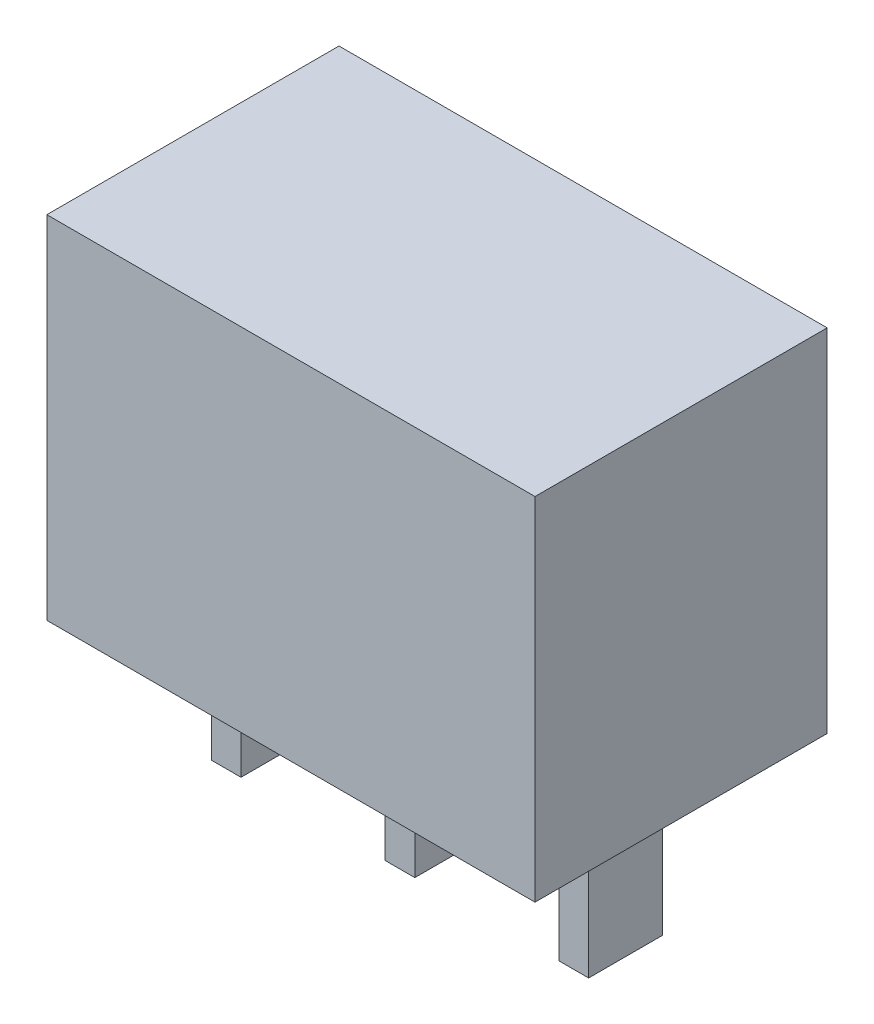
ISO-10303-21;
HEADER;
FILE_DESCRIPTION(('STEP AP214'),'2;1');
FILE_NAME('part.step','',(''),(''),'','','');
FILE_SCHEMA(('AUTOMOTIVE_DESIGN { 1 0 10303 214 1 1 1 1 }'));
ENDSEC;
DATA;
#1=APPLICATION_CONTEXT('core data for automotive mechanical design processes');
#2=APPLICATION_PROTOCOL_DEFINITION('international standard','automotive_design',2000,#1);
#3=PRODUCT_CONTEXT('',#1,'mechanical');
#4=PRODUCT('Part','Part','',(#3));
#5=PRODUCT_RELATED_PRODUCT_CATEGORY('part','',(#4));
#6=PRODUCT_DEFINITION_FORMATION('','',#4);
#7=PRODUCT_DEFINITION_CONTEXT('part definition',#1,'design');
#8=PRODUCT_DEFINITION('design','',#6,#7);
#9=PRODUCT_DEFINITION_SHAPE('','',#8);
#10=(LENGTH_UNIT() NAMED_UNIT(*) SI_UNIT(.MILLI.,.METRE.));
#11=(NAMED_UNIT(*) PLANE_ANGLE_UNIT() SI_UNIT($,.RADIAN.));
#12=(NAMED_UNIT(*) SI_UNIT($,.STERADIAN.) SOLID_ANGLE_UNIT());
#13=UNCERTAINTY_MEASURE_WITH_UNIT(LENGTH_MEASURE(1.E-05),#10,'distance_accuracy_value','');
#14=(GEOMETRIC_REPRESENTATION_CONTEXT(3) GLOBAL_UNCERTAINTY_ASSIGNED_CONTEXT((#13)) GLOBAL_UNIT_ASSIGNED_CONTEXT((#10,
#11,#12)) REPRESENTATION_CONTEXT('',''));
#15=CARTESIAN_POINT('',(0.,0.,0.));
#16=DIRECTION('',(0.,0.,1.));
#17=DIRECTION('',(1.,0.,0.));
#18=AXIS2_PLACEMENT_3D('',#15,#16,#17);
#19=CARTESIAN_POINT('',(0.,0.,0.));
#20=DIRECTION('',(0.,1.,0.));
#21=DIRECTION('',(0.,0.,1.));
#22=AXIS2_PLACEMENT_3D('',#19,#20,#21);
#23=PLANE('',#22);
#24=DIRECTION('',(0.,0.,1.));
#25=VECTOR('',#24,1.);
#26=CARTESIAN_POINT('',(5.1,0.,1.));
#27=LINE('',#26,#25);
#28=CARTESIAN_POINT('',(5.1,0.,-1.));
#29=VERTEX_POINT('',#28);
#30=CARTESIAN_POINT('',(5.1,0.,1.));
#31=VERTEX_POINT('',#30);
#32=EDGE_CURVE('E227',#29,#31,#27,.T.);
#33=ORIENTED_EDGE('',*,*,#32,.F.);
#34=DIRECTION('',(1.,0.,0.));
#35=VECTOR('',#34,1.);
#36=CARTESIAN_POINT('',(4.3,0.,-1.));
#37=LINE('',#36,#35);
#38=CARTESIAN_POINT('',(4.3,0.,-1.));
#39=VERTEX_POINT('',#38);
#40=EDGE_CURVE('E214',#39,#29,#37,.T.);
#41=ORIENTED_EDGE('',*,*,#40,.F.);
#42=DIRECTION('',(0.,0.,-1.));
#43=VECTOR('',#42,1.);
#44=CARTESIAN_POINT('',(4.3,0.,1.));
#45=LINE('',#44,#43);
#46=CARTESIAN_POINT('',(4.3,0.,1.));
#47=VERTEX_POINT('',#46);
#48=EDGE_CURVE('E218',#47,#39,#45,.T.);
#49=ORIENTED_EDGE('',*,*,#48,.F.);
#50=DIRECTION('',(-1.,0.,0.));
#51=VECTOR('',#50,1.);
#52=CARTESIAN_POINT('',(4.3,0.,1.));
#53=LINE('',#52,#51);
#54=EDGE_CURVE('E223',#31,#47,#53,.T.);
#55=ORIENTED_EDGE('',*,*,#54,.F.);
#56=EDGE_LOOP('',(#33,#41,#49,#55));
#57=FACE_BOUND('',#56,.T.);
#58=DIRECTION('',(0.,0.,-1.));
#59=VECTOR('',#58,1.);
#60=CARTESIAN_POINT('',(6.6,0.,-3.95));
#61=LINE('',#60,#59);
#62=CARTESIAN_POINT('',(6.6,0.,3.95));
#63=VERTEX_POINT('',#62);
#64=CARTESIAN_POINT('',(6.6,0.,-3.95));
#65=VERTEX_POINT('',#64);
#66=EDGE_CURVE('E287',#63,#65,#61,.T.);
#67=ORIENTED_EDGE('',*,*,#66,.F.);
#68=DIRECTION('',(1.,0.,0.));
#69=VECTOR('',#68,1.);
#70=CARTESIAN_POINT('',(-6.6,0.,3.95));
#71=LINE('',#70,#69);
#72=CARTESIAN_POINT('',(-6.6,0.,3.95));
#73=VERTEX_POINT('',#72);
#74=EDGE_CURVE('E293',#73,#63,#71,.T.);
#75=ORIENTED_EDGE('',*,*,#74,.F.);
#76=DIRECTION('',(0.,0.,1.));
#77=VECTOR('',#76,1.);
#78=CARTESIAN_POINT('',(-6.6,0.,-3.95));
#79=LINE('',#78,#77);
#80=CARTESIAN_POINT('',(-6.6,0.,-3.95));
#81=VERTEX_POINT('',#80);
#82=EDGE_CURVE('E309',#81,#73,#79,.T.);
#83=ORIENTED_EDGE('',*,*,#82,.F.);
#84=DIRECTION('',(-1.,0.,0.));
#85=VECTOR('',#84,1.);
#86=CARTESIAN_POINT('',(-6.6,0.,-3.95));
#87=LINE('',#86,#85);
#88=EDGE_CURVE('E306',#65,#81,#87,.T.);
#89=ORIENTED_EDGE('',*,*,#88,.F.);
#90=EDGE_LOOP('',(#67,#75,#83,#89));
#91=FACE_BOUND('',#90,.T.);
#92=DIRECTION('',(0.,0.,1.));
#93=VECTOR('',#92,1.);
#94=CARTESIAN_POINT('',(0.4,0.,1.));
#95=LINE('',#94,#93);
#96=CARTESIAN_POINT('',(0.4,0.,-1.));
#97=VERTEX_POINT('',#96);
#98=CARTESIAN_POINT('',(0.4,0.,1.));
#99=VERTEX_POINT('',#98);
#100=EDGE_CURVE('E231',#97,#99,#95,.T.);
#101=ORIENTED_EDGE('',*,*,#100,.F.);
#102=DIRECTION('',(1.,0.,0.));
#103=VECTOR('',#102,1.);
#104=CARTESIAN_POINT('',(-0.4,0.,-1.));
#105=LINE('',#104,#103);
#106=CARTESIAN_POINT('',(-0.4,0.,-1.));
#107=VERTEX_POINT('',#106);
#108=EDGE_CURVE('E248',#107,#97,#105,.T.);
#109=ORIENTED_EDGE('',*,*,#108,.F.);
#110=DIRECTION('',(0.,0.,-1.));
#111=VECTOR('',#110,1.);
#112=CARTESIAN_POINT('',(-0.4,0.,1.));
#113=LINE('',#112,#111);
#114=CARTESIAN_POINT('',(-0.4,0.,1.));
#115=VERTEX_POINT('',#114);
#116=EDGE_CURVE('E265',#115,#107,#113,.T.);
#117=ORIENTED_EDGE('',*,*,#116,.F.);
#118=DIRECTION('',(-1.,0.,0.));
#119=VECTOR('',#118,1.);
#120=CARTESIAN_POINT('',(-0.4,0.,1.));
#121=LINE('',#120,#119);
#122=EDGE_CURVE('E261',#99,#115,#121,.T.);
#123=ORIENTED_EDGE('',*,*,#122,.F.);
#124=EDGE_LOOP('',(#101,#109,#117,#123));
#125=FACE_BOUND('',#124,.T.);
#126=DIRECTION('',(0.,0.,1.));
#127=VECTOR('',#126,1.);
#128=CARTESIAN_POINT('',(-4.3,0.,1.));
#129=LINE('',#128,#127);
#130=CARTESIAN_POINT('',(-4.3,0.,-1.));
#131=VERTEX_POINT('',#130);
#132=CARTESIAN_POINT('',(-4.3,0.,1.));
#133=VERTEX_POINT('',#132);
#134=EDGE_CURVE('E153',#131,#133,#129,.T.);
#135=ORIENTED_EDGE('',*,*,#134,.F.);
#136=DIRECTION('',(1.,0.,0.));
#137=VECTOR('',#136,1.);
#138=CARTESIAN_POINT('',(-5.1,0.,-1.));
#139=LINE('',#138,#137);
#140=CARTESIAN_POINT('',(-5.1,0.,-1.));
#141=VERTEX_POINT('',#140);
#142=EDGE_CURVE('E155',#141,#131,#139,.T.);
#143=ORIENTED_EDGE('',*,*,#142,.F.);
#144=DIRECTION('',(0.,0.,-1.));
#145=VECTOR('',#144,1.);
#146=CARTESIAN_POINT('',(-5.1,0.,1.));
#147=LINE('',#146,#145);
#148=CARTESIAN_POINT('',(-5.1,0.,1.));
#149=VERTEX_POINT('',#148);
#150=EDGE_CURVE('E64',#149,#141,#147,.T.);
#151=ORIENTED_EDGE('',*,*,#150,.F.);
#152=DIRECTION('',(-1.,0.,0.));
#153=VECTOR('',#152,1.);
#154=CARTESIAN_POINT('',(-5.1,0.,1.));
#155=LINE('',#154,#153);
#156=EDGE_CURVE('E59',#133,#149,#155,.T.);
#157=ORIENTED_EDGE('',*,*,#156,.F.);
#158=EDGE_LOOP('',(#135,#143,#151,#157));
#159=FACE_BOUND('',#158,.T.);
#160=ADVANCED_FACE('F43',(#57,#91,#125,#159),#23,.F.);
#161=CARTESIAN_POINT('',(6.6,9.5,-3.95));
#162=DIRECTION('',(-1.,0.,0.));
#163=DIRECTION('',(0.,0.,1.));
#164=AXIS2_PLACEMENT_3D('',#161,#162,#163);
#165=PLANE('',#164);
#166=ORIENTED_EDGE('',*,*,#66,.T.);
#167=DIRECTION('',(0.,-1.,0.));
#168=VECTOR('',#167,1.);
#169=CARTESIAN_POINT('',(6.6,9.5,-3.95));
#170=LINE('',#169,#168);
#171=CARTESIAN_POINT('',(6.6,9.5,-3.95));
#172=VERTEX_POINT('',#171);
#173=EDGE_CURVE('E11',#172,#65,#170,.T.);
#174=ORIENTED_EDGE('',*,*,#173,.F.);
#175=DIRECTION('',(0.,0.,-1.));
#176=VECTOR('',#175,1.);
#177=CARTESIAN_POINT('',(6.6,9.5,-3.95));
#178=LINE('',#177,#176);
#179=CARTESIAN_POINT('',(6.6,9.5,3.95));
#180=VERTEX_POINT('',#179);
#181=EDGE_CURVE('E288',#180,#172,#178,.T.);
#182=ORIENTED_EDGE('',*,*,#181,.F.);
#183=DIRECTION('',(0.,-1.,0.));
#184=VECTOR('',#183,1.);
#185=CARTESIAN_POINT('',(6.6,9.5,3.95));
#186=LINE('',#185,#184);
#187=EDGE_CURVE('E302',#180,#63,#186,.T.);
#188=ORIENTED_EDGE('',*,*,#187,.T.);
#189=EDGE_LOOP('',(#166,#174,#182,#188));
#190=FACE_BOUND('',#189,.T.);
#191=ADVANCED_FACE('F45',(#190),#165,.F.);
#192=CARTESIAN_POINT('',(-6.6,9.5,-3.95));
#193=DIRECTION('',(0.,0.,1.));
#194=DIRECTION('',(1.,0.,0.));
#195=AXIS2_PLACEMENT_3D('',#192,#193,#194);
#196=PLANE('',#195);
#197=ORIENTED_EDGE('',*,*,#88,.T.);
#198=DIRECTION('',(0.,-1.,0.));
#199=VECTOR('',#198,1.);
#200=CARTESIAN_POINT('',(-6.6,9.5,-3.95));
#201=LINE('',#200,#199);
#202=CARTESIAN_POINT('',(-6.6,9.5,-3.95));
#203=VERTEX_POINT('',#202);
#204=EDGE_CURVE('E52',#203,#81,#201,.T.);
#205=ORIENTED_EDGE('',*,*,#204,.F.);
#206=DIRECTION('',(-1.,0.,0.));
#207=VECTOR('',#206,1.);
#208=CARTESIAN_POINT('',(-6.6,9.5,-3.95));
#209=LINE('',#208,#207);
#210=EDGE_CURVE('E292',#172,#203,#209,.T.);
#211=ORIENTED_EDGE('',*,*,#210,.F.);
#212=ORIENTED_EDGE('',*,*,#173,.T.);
#213=EDGE_LOOP('',(#197,#205,#211,#212));
#214=FACE_BOUND('',#213,.T.);
#215=ADVANCED_FACE('F342',(#214),#196,.F.);
#216=CARTESIAN_POINT('',(-6.6,9.5,-3.95));
#217=DIRECTION('',(1.,0.,0.));
#218=DIRECTION('',(0.,0.,-1.));
#219=AXIS2_PLACEMENT_3D('',#216,#217,#218);
#220=PLANE('',#219);
#221=ORIENTED_EDGE('',*,*,#82,.T.);
#222=DIRECTION('',(0.,-1.,0.));
#223=VECTOR('',#222,1.);
#224=CARTESIAN_POINT('',(-6.6,9.5,3.95));
#225=LINE('',#224,#223);
#226=CARTESIAN_POINT('',(-6.6,9.5,3.95));
#227=VERTEX_POINT('',#226);
#228=EDGE_CURVE('E317',#227,#73,#225,.T.);
#229=ORIENTED_EDGE('',*,*,#228,.F.);
#230=DIRECTION('',(0.,0.,1.));
#231=VECTOR('',#230,1.);
#232=CARTESIAN_POINT('',(-6.6,9.5,-3.95));
#233=LINE('',#232,#231);
#234=EDGE_CURVE('E296',#203,#227,#233,.T.);
#235=ORIENTED_EDGE('',*,*,#234,.F.);
#236=ORIENTED_EDGE('',*,*,#204,.T.);
#237=EDGE_LOOP('',(#221,#229,#235,#236));
#238=FACE_BOUND('',#237,.T.);
#239=ADVANCED_FACE('F326',(#238),#220,.F.);
#240=CARTESIAN_POINT('',(-6.6,9.5,3.95));
#241=DIRECTION('',(0.,0.,-1.));
#242=DIRECTION('',(-1.,0.,0.));
#243=AXIS2_PLACEMENT_3D('',#240,#241,#242);
#244=PLANE('',#243);
#245=ORIENTED_EDGE('',*,*,#74,.T.);
#246=ORIENTED_EDGE('',*,*,#187,.F.);
#247=DIRECTION('',(1.,0.,0.));
#248=VECTOR('',#247,1.);
#249=CARTESIAN_POINT('',(-6.6,9.5,3.95));
#250=LINE('',#249,#248);
#251=EDGE_CURVE('E299',#227,#180,#250,.T.);
#252=ORIENTED_EDGE('',*,*,#251,.F.);
#253=ORIENTED_EDGE('',*,*,#228,.T.);
#254=EDGE_LOOP('',(#245,#246,#252,#253));
#255=FACE_BOUND('',#254,.T.);
#256=ADVANCED_FACE('F335',(#255),#244,.F.);
#257=CARTESIAN_POINT('',(0.,9.5,0.));
#258=DIRECTION('',(0.,1.,0.));
#259=DIRECTION('',(0.,0.,1.));
#260=AXIS2_PLACEMENT_3D('',#257,#258,#259);
#261=PLANE('',#260);
#262=ORIENTED_EDGE('',*,*,#181,.T.);
#263=ORIENTED_EDGE('',*,*,#210,.T.);
#264=ORIENTED_EDGE('',*,*,#234,.T.);
#265=ORIENTED_EDGE('',*,*,#251,.T.);
#266=EDGE_LOOP('',(#262,#263,#264,#265));
#267=FACE_BOUND('',#266,.T.);
#268=ADVANCED_FACE('F341',(#267),#261,.T.);
#269=CARTESIAN_POINT('',(0.4,-4.,1.));
#270=DIRECTION('',(-1.,0.,0.));
#271=DIRECTION('',(0.,0.,1.));
#272=AXIS2_PLACEMENT_3D('',#269,#270,#271);
#273=PLANE('',#272);
#274=ORIENTED_EDGE('',*,*,#100,.T.);
#275=DIRECTION('',(0.,1.,0.));
#276=VECTOR('',#275,1.);
#277=CARTESIAN_POINT('',(0.4,-4.,1.));
#278=LINE('',#277,#276);
#279=CARTESIAN_POINT('',(0.4,-4.,1.));
#280=VERTEX_POINT('',#279);
#281=EDGE_CURVE('E283',#280,#99,#278,.T.);
#282=ORIENTED_EDGE('',*,*,#281,.F.);
#283=DIRECTION('',(0.,0.,1.));
#284=VECTOR('',#283,1.);
#285=CARTESIAN_POINT('',(0.4,-4.,1.));
#286=LINE('',#285,#284);
#287=CARTESIAN_POINT('',(0.4,-4.,-1.));
#288=VERTEX_POINT('',#287);
#289=EDGE_CURVE('E243',#288,#280,#286,.T.);
#290=ORIENTED_EDGE('',*,*,#289,.F.);
#291=DIRECTION('',(0.,1.,0.));
#292=VECTOR('',#291,1.);
#293=CARTESIAN_POINT('',(0.4,-4.,-1.));
#294=LINE('',#293,#292);
#295=EDGE_CURVE('E257',#288,#97,#294,.T.);
#296=ORIENTED_EDGE('',*,*,#295,.T.);
#297=EDGE_LOOP('',(#274,#282,#290,#296));
#298=FACE_BOUND('',#297,.T.);
#299=ADVANCED_FACE('F361',(#298),#273,.F.);
#300=CARTESIAN_POINT('',(-0.4,-4.,1.));
#301=DIRECTION('',(0.,0.,-1.));
#302=DIRECTION('',(-1.,0.,0.));
#303=AXIS2_PLACEMENT_3D('',#300,#301,#302);
#304=PLANE('',#303);
#305=ORIENTED_EDGE('',*,*,#122,.T.);
#306=DIRECTION('',(0.,1.,0.));
#307=VECTOR('',#306,1.);
#308=CARTESIAN_POINT('',(-0.4,-4.,1.));
#309=LINE('',#308,#307);
#310=CARTESIAN_POINT('',(-0.4,-4.,1.));
#311=VERTEX_POINT('',#310);
#312=EDGE_CURVE('E279',#311,#115,#309,.T.);
#313=ORIENTED_EDGE('',*,*,#312,.F.);
#314=DIRECTION('',(-1.,0.,0.));
#315=VECTOR('',#314,1.);
#316=CARTESIAN_POINT('',(-0.4,-4.,1.));
#317=LINE('',#316,#315);
#318=EDGE_CURVE('E247',#280,#311,#317,.T.);
#319=ORIENTED_EDGE('',*,*,#318,.F.);
#320=ORIENTED_EDGE('',*,*,#281,.T.);
#321=EDGE_LOOP('',(#305,#313,#319,#320));
#322=FACE_BOUND('',#321,.T.);
#323=ADVANCED_FACE('F365',(#322),#304,.F.);
#324=CARTESIAN_POINT('',(-0.4,-4.,1.));
#325=DIRECTION('',(1.,0.,0.));
#326=DIRECTION('',(0.,0.,-1.));
#327=AXIS2_PLACEMENT_3D('',#324,#325,#326);
#328=PLANE('',#327);
#329=ORIENTED_EDGE('',*,*,#116,.T.);
#330=DIRECTION('',(0.,1.,0.));
#331=VECTOR('',#330,1.);
#332=CARTESIAN_POINT('',(-0.4,-4.,-1.));
#333=LINE('',#332,#331);
#334=CARTESIAN_POINT('',(-0.4,-4.,-1.));
#335=VERTEX_POINT('',#334);
#336=EDGE_CURVE('E275',#335,#107,#333,.T.);
#337=ORIENTED_EDGE('',*,*,#336,.F.);
#338=DIRECTION('',(0.,0.,-1.));
#339=VECTOR('',#338,1.);
#340=CARTESIAN_POINT('',(-0.4,-4.,1.));
#341=LINE('',#340,#339);
#342=EDGE_CURVE('E251',#311,#335,#341,.T.);
#343=ORIENTED_EDGE('',*,*,#342,.F.);
#344=ORIENTED_EDGE('',*,*,#312,.T.);
#345=EDGE_LOOP('',(#329,#337,#343,#344));
#346=FACE_BOUND('',#345,.T.);
#347=ADVANCED_FACE('F370',(#346),#328,.F.);
#348=CARTESIAN_POINT('',(-0.4,-4.,-1.));
#349=DIRECTION('',(0.,0.,1.));
#350=DIRECTION('',(1.,0.,0.));
#351=AXIS2_PLACEMENT_3D('',#348,#349,#350);
#352=PLANE('',#351);
#353=ORIENTED_EDGE('',*,*,#108,.T.);
#354=ORIENTED_EDGE('',*,*,#295,.F.);
#355=DIRECTION('',(1.,0.,0.));
#356=VECTOR('',#355,1.);
#357=CARTESIAN_POINT('',(-0.4,-4.,-1.));
#358=LINE('',#357,#356);
#359=EDGE_CURVE('E254',#335,#288,#358,.T.);
#360=ORIENTED_EDGE('',*,*,#359,.F.);
#361=ORIENTED_EDGE('',*,*,#336,.T.);
#362=EDGE_LOOP('',(#353,#354,#360,#361));
#363=FACE_BOUND('',#362,.T.);
#364=ADVANCED_FACE('F376',(#363),#352,.F.);
#365=CARTESIAN_POINT('',(0.,-4.,0.));
#366=DIRECTION('',(0.,-1.,0.));
#367=DIRECTION('',(0.,0.,-1.));
#368=AXIS2_PLACEMENT_3D('',#365,#366,#367);
#369=PLANE('',#368);
#370=ORIENTED_EDGE('',*,*,#289,.T.);
#371=ORIENTED_EDGE('',*,*,#318,.T.);
#372=ORIENTED_EDGE('',*,*,#342,.T.);
#373=ORIENTED_EDGE('',*,*,#359,.T.);
#374=EDGE_LOOP('',(#370,#371,#372,#373));
#375=FACE_BOUND('',#374,.T.);
#376=ADVANCED_FACE('F380',(#375),#369,.T.);
#377=CARTESIAN_POINT('',(5.1,-4.,1.));
#378=DIRECTION('',(-1.,0.,0.));
#379=DIRECTION('',(0.,0.,1.));
#380=AXIS2_PLACEMENT_3D('',#377,#378,#379);
#381=PLANE('',#380);
#382=ORIENTED_EDGE('',*,*,#32,.T.);
#383=DIRECTION('',(0.,1.,0.));
#384=VECTOR('',#383,1.);
#385=CARTESIAN_POINT('',(5.1,-4.,1.));
#386=LINE('',#385,#384);
#387=CARTESIAN_POINT('',(5.1,-4.,1.));
#388=VERTEX_POINT('',#387);
#389=EDGE_CURVE('E160',#388,#31,#386,.T.);
#390=ORIENTED_EDGE('',*,*,#389,.F.);
#391=DIRECTION('',(0.,0.,1.));
#392=VECTOR('',#391,1.);
#393=CARTESIAN_POINT('',(5.1,-4.,1.));
#394=LINE('',#393,#392);
#395=CARTESIAN_POINT('',(5.1,-4.,-1.));
#396=VERTEX_POINT('',#395);
#397=EDGE_CURVE('E219',#396,#388,#394,.T.);
#398=ORIENTED_EDGE('',*,*,#397,.F.);
#399=DIRECTION('',(0.,1.,0.));
#400=VECTOR('',#399,1.);
#401=CARTESIAN_POINT('',(5.1,-4.,-1.));
#402=LINE('',#401,#400);
#403=EDGE_CURVE('E209',#396,#29,#402,.T.);
#404=ORIENTED_EDGE('',*,*,#403,.T.);
#405=EDGE_LOOP('',(#382,#390,#398,#404));
#406=FACE_BOUND('',#405,.T.);
#407=ADVANCED_FACE('F384',(#406),#381,.F.);
#408=CARTESIAN_POINT('',(4.3,-4.,1.));
#409=DIRECTION('',(0.,0.,-1.));
#410=DIRECTION('',(-1.,0.,0.));
#411=AXIS2_PLACEMENT_3D('',#408,#409,#410);
#412=PLANE('',#411);
#413=ORIENTED_EDGE('',*,*,#54,.T.);
#414=DIRECTION('',(0.,1.,0.));
#415=VECTOR('',#414,1.);
#416=CARTESIAN_POINT('',(4.3,-4.,1.));
#417=LINE('',#416,#415);
#418=CARTESIAN_POINT('',(4.3,-4.,1.));
#419=VERTEX_POINT('',#418);
#420=EDGE_CURVE('E201',#419,#47,#417,.T.);
#421=ORIENTED_EDGE('',*,*,#420,.F.);
#422=DIRECTION('',(-1.,0.,0.));
#423=VECTOR('',#422,1.);
#424=CARTESIAN_POINT('',(4.3,-4.,1.));
#425=LINE('',#424,#423);
#426=EDGE_CURVE('E237',#388,#419,#425,.T.);
#427=ORIENTED_EDGE('',*,*,#426,.F.);
#428=ORIENTED_EDGE('',*,*,#389,.T.);
#429=EDGE_LOOP('',(#413,#421,#427,#428));
#430=FACE_BOUND('',#429,.T.);
#431=ADVANCED_FACE('F397',(#430),#412,.F.);
#432=CARTESIAN_POINT('',(4.3,-4.,1.));
#433=DIRECTION('',(1.,0.,0.));
#434=DIRECTION('',(0.,0.,-1.));
#435=AXIS2_PLACEMENT_3D('',#432,#433,#434);
#436=PLANE('',#435);
#437=ORIENTED_EDGE('',*,*,#48,.T.);
#438=DIRECTION('',(0.,1.,0.));
#439=VECTOR('',#438,1.);
#440=CARTESIAN_POINT('',(4.3,-4.,-1.));
#441=LINE('',#440,#439);
#442=CARTESIAN_POINT('',(4.3,-4.,-1.));
#443=VERTEX_POINT('',#442);
#444=EDGE_CURVE('E205',#443,#39,#441,.T.);
#445=ORIENTED_EDGE('',*,*,#444,.F.);
#446=DIRECTION('',(0.,0.,-1.));
#447=VECTOR('',#446,1.);
#448=CARTESIAN_POINT('',(4.3,-4.,1.));
#449=LINE('',#448,#447);
#450=EDGE_CURVE('E234',#419,#443,#449,.T.);
#451=ORIENTED_EDGE('',*,*,#450,.F.);
#452=ORIENTED_EDGE('',*,*,#420,.T.);
#453=EDGE_LOOP('',(#437,#445,#451,#452));
#454=FACE_BOUND('',#453,.T.);
#455=ADVANCED_FACE('F393',(#454),#436,.F.);
#456=CARTESIAN_POINT('',(4.3,-4.,-1.));
#457=DIRECTION('',(0.,0.,1.));
#458=DIRECTION('',(1.,0.,0.));
#459=AXIS2_PLACEMENT_3D('',#456,#457,#458);
#460=PLANE('',#459);
#461=ORIENTED_EDGE('',*,*,#40,.T.);
#462=ORIENTED_EDGE('',*,*,#403,.F.);
#463=DIRECTION('',(1.,0.,0.));
#464=VECTOR('',#463,1.);
#465=CARTESIAN_POINT('',(4.3,-4.,-1.));
#466=LINE('',#465,#464);
#467=EDGE_CURVE('E213',#443,#396,#466,.T.);
#468=ORIENTED_EDGE('',*,*,#467,.F.);
#469=ORIENTED_EDGE('',*,*,#444,.T.);
#470=EDGE_LOOP('',(#461,#462,#468,#469));
#471=FACE_BOUND('',#470,.T.);
#472=ADVANCED_FACE('F389',(#471),#460,.F.);
#473=CARTESIAN_POINT('',(0.,-4.,0.));
#474=DIRECTION('',(0.,-1.,0.));
#475=DIRECTION('',(0.,0.,-1.));
#476=AXIS2_PLACEMENT_3D('',#473,#474,#475);
#477=PLANE('',#476);
#478=ORIENTED_EDGE('',*,*,#397,.T.);
#479=ORIENTED_EDGE('',*,*,#426,.T.);
#480=ORIENTED_EDGE('',*,*,#450,.T.);
#481=ORIENTED_EDGE('',*,*,#467,.T.);
#482=EDGE_LOOP('',(#478,#479,#480,#481));
#483=FACE_BOUND('',#482,.T.);
#484=ADVANCED_FACE('F386',(#483),#477,.T.);
#485=CARTESIAN_POINT('',(-4.3,-4.,1.));
#486=DIRECTION('',(-1.,0.,0.));
#487=DIRECTION('',(0.,0.,1.));
#488=AXIS2_PLACEMENT_3D('',#485,#486,#487);
#489=PLANE('',#488);
#490=ORIENTED_EDGE('',*,*,#134,.T.);
#491=DIRECTION('',(0.,1.,0.));
#492=VECTOR('',#491,1.);
#493=CARTESIAN_POINT('',(-4.3,-4.,1.));
#494=LINE('',#493,#492);
#495=CARTESIAN_POINT('',(-4.3,-4.,1.));
#496=VERTEX_POINT('',#495);
#497=EDGE_CURVE('E581',#496,#133,#494,.T.);
#498=ORIENTED_EDGE('',*,*,#497,.F.);
#499=DIRECTION('',(0.,0.,1.));
#500=VECTOR('',#499,1.);
#501=CARTESIAN_POINT('',(-4.3,-4.,1.));
#502=LINE('',#501,#500);
#503=CARTESIAN_POINT('',(-4.3,-4.,-1.));
#504=VERTEX_POINT('',#503);
#505=EDGE_CURVE('E172',#504,#496,#502,.T.);
#506=ORIENTED_EDGE('',*,*,#505,.F.);
#507=DIRECTION('',(0.,1.,0.));
#508=VECTOR('',#507,1.);
#509=CARTESIAN_POINT('',(-4.3,-4.,-1.));
#510=LINE('',#509,#508);
#511=EDGE_CURVE('E167',#504,#131,#510,.T.);
#512=ORIENTED_EDGE('',*,*,#511,.T.);
#513=EDGE_LOOP('',(#490,#498,#506,#512));
#514=FACE_BOUND('',#513,.T.);
#515=ADVANCED_FACE('F174',(#514),#489,.F.);
#516=CARTESIAN_POINT('',(-5.1,-4.,1.));
#517=DIRECTION('',(0.,0.,-1.));
#518=DIRECTION('',(-1.,0.,0.));
#519=AXIS2_PLACEMENT_3D('',#516,#517,#518);
#520=PLANE('',#519);
#521=ORIENTED_EDGE('',*,*,#156,.T.);
#522=DIRECTION('',(0.,1.,0.));
#523=VECTOR('',#522,1.);
#524=CARTESIAN_POINT('',(-5.1,-4.,1.));
#525=LINE('',#524,#523);
#526=CARTESIAN_POINT('',(-5.1,-4.,1.));
#527=VERTEX_POINT('',#526);
#528=EDGE_CURVE('E183',#527,#149,#525,.T.);
#529=ORIENTED_EDGE('',*,*,#528,.F.);
#530=DIRECTION('',(-1.,0.,0.));
#531=VECTOR('',#530,1.);
#532=CARTESIAN_POINT('',(-5.1,-4.,1.));
#533=LINE('',#532,#531);
#534=EDGE_CURVE('E193',#496,#527,#533,.T.);
#535=ORIENTED_EDGE('',*,*,#534,.F.);
#536=ORIENTED_EDGE('',*,*,#497,.T.);
#537=EDGE_LOOP('',(#521,#529,#535,#536));
#538=FACE_BOUND('',#537,.T.);
#539=ADVANCED_FACE('F414',(#538),#520,.F.);
#540=CARTESIAN_POINT('',(-5.1,-4.,1.));
#541=DIRECTION('',(1.,0.,0.));
#542=DIRECTION('',(0.,0.,-1.));
#543=AXIS2_PLACEMENT_3D('',#540,#541,#542);
#544=PLANE('',#543);
#545=ORIENTED_EDGE('',*,*,#150,.T.);
#546=DIRECTION('',(0.,1.,0.));
#547=VECTOR('',#546,1.);
#548=CARTESIAN_POINT('',(-5.1,-4.,-1.));
#549=LINE('',#548,#547);
#550=CARTESIAN_POINT('',(-5.1,-4.,-1.));
#551=VERTEX_POINT('',#550);
#552=EDGE_CURVE('E170',#551,#141,#549,.T.);
#553=ORIENTED_EDGE('',*,*,#552,.F.);
#554=DIRECTION('',(0.,0.,-1.));
#555=VECTOR('',#554,1.);
#556=CARTESIAN_POINT('',(-5.1,-4.,1.));
#557=LINE('',#556,#555);
#558=EDGE_CURVE('E181',#527,#551,#557,.T.);
#559=ORIENTED_EDGE('',*,*,#558,.F.);
#560=ORIENTED_EDGE('',*,*,#528,.T.);
#561=EDGE_LOOP('',(#545,#553,#559,#560));
#562=FACE_BOUND('',#561,.T.);
#563=ADVANCED_FACE('F411',(#562),#544,.F.);
#564=CARTESIAN_POINT('',(-5.1,-4.,-1.));
#565=DIRECTION('',(0.,0.,1.));
#566=DIRECTION('',(1.,0.,0.));
#567=AXIS2_PLACEMENT_3D('',#564,#565,#566);
#568=PLANE('',#567);
#569=ORIENTED_EDGE('',*,*,#142,.T.);
#570=ORIENTED_EDGE('',*,*,#511,.F.);
#571=DIRECTION('',(1.,0.,0.));
#572=VECTOR('',#571,1.);
#573=CARTESIAN_POINT('',(-5.1,-4.,-1.));
#574=LINE('',#573,#572);
#575=EDGE_CURVE('E177',#551,#504,#574,.T.);
#576=ORIENTED_EDGE('',*,*,#575,.F.);
#577=ORIENTED_EDGE('',*,*,#552,.T.);
#578=EDGE_LOOP('',(#569,#570,#576,#577));
#579=FACE_BOUND('',#578,.T.);
#580=ADVANCED_FACE('F165',(#579),#568,.F.);
#581=CARTESIAN_POINT('',(0.,-4.,0.));
#582=DIRECTION('',(0.,-1.,0.));
#583=DIRECTION('',(0.,0.,-1.));
#584=AXIS2_PLACEMENT_3D('',#581,#582,#583);
#585=PLANE('',#584);
#586=ORIENTED_EDGE('',*,*,#505,.T.);
#587=ORIENTED_EDGE('',*,*,#534,.T.);
#588=ORIENTED_EDGE('',*,*,#558,.T.);
#589=ORIENTED_EDGE('',*,*,#575,.T.);
#590=EDGE_LOOP('',(#586,#587,#588,#589));
#591=FACE_BOUND('',#590,.T.);
#592=ADVANCED_FACE('F405',(#591),#585,.T.);
#593=CLOSED_SHELL('',(#160,#191,#215,#239,#256,#268,#299,#323,#347,#364,#376,#407,#431,#455,
#472,#484,#515,#539,#563,#580,#592));
#594=MANIFOLD_SOLID_BREP('B2',#593);
#595=ADVANCED_BREP_SHAPE_REPRESENTATION('',(#18,#594),#14);
#596=SHAPE_DEFINITION_REPRESENTATION(#9,#595);
ENDSEC;
END-ISO-10303-21;
